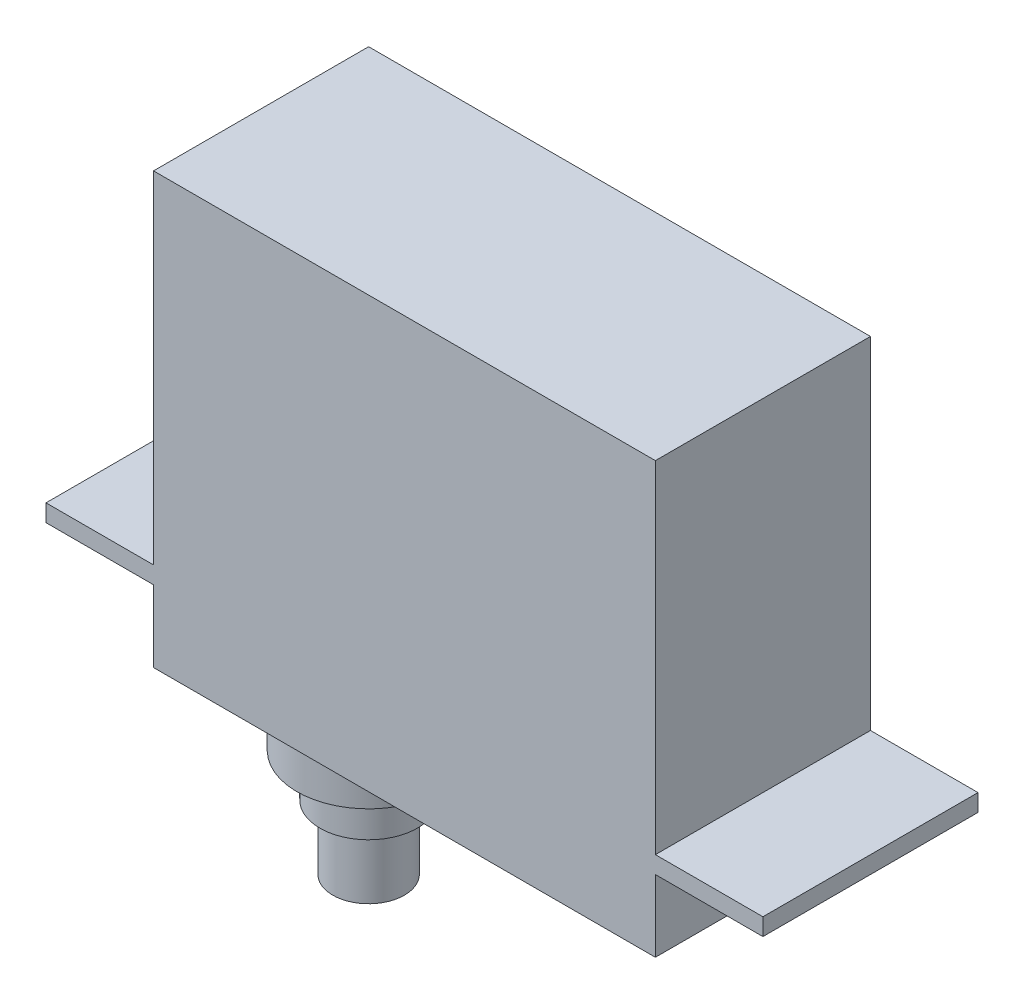
ISO-10303-21;
HEADER;
FILE_DESCRIPTION(('STEP AP214'),'2;1');
FILE_NAME('part.step','',(''),(''),'','','');
FILE_SCHEMA(('AUTOMOTIVE_DESIGN { 1 0 10303 214 1 1 1 1 }'));
ENDSEC;
DATA;
#1=APPLICATION_CONTEXT('core data for automotive mechanical design processes');
#2=APPLICATION_PROTOCOL_DEFINITION('international standard','automotive_design',2000,#1);
#3=PRODUCT_CONTEXT('',#1,'mechanical');
#4=PRODUCT('Part','Part','',(#3));
#5=PRODUCT_RELATED_PRODUCT_CATEGORY('part','',(#4));
#6=PRODUCT_DEFINITION_FORMATION('','',#4);
#7=PRODUCT_DEFINITION_CONTEXT('part definition',#1,'design');
#8=PRODUCT_DEFINITION('design','',#6,#7);
#9=PRODUCT_DEFINITION_SHAPE('','',#8);
#10=(LENGTH_UNIT() NAMED_UNIT(*) SI_UNIT(.MILLI.,.METRE.));
#11=(NAMED_UNIT(*) PLANE_ANGLE_UNIT() SI_UNIT($,.RADIAN.));
#12=(NAMED_UNIT(*) SI_UNIT($,.STERADIAN.) SOLID_ANGLE_UNIT());
#13=UNCERTAINTY_MEASURE_WITH_UNIT(LENGTH_MEASURE(1.E-05),#10,'distance_accuracy_value','');
#14=(GEOMETRIC_REPRESENTATION_CONTEXT(3) GLOBAL_UNCERTAINTY_ASSIGNED_CONTEXT((#13)) GLOBAL_UNIT_ASSIGNED_CONTEXT((#10,
#11,#12)) REPRESENTATION_CONTEXT('',''));
#15=CARTESIAN_POINT('',(0.,0.,0.));
#16=DIRECTION('',(0.,0.,1.));
#17=DIRECTION('',(1.,0.,0.));
#18=AXIS2_PLACEMENT_3D('',#15,#16,#17);
#19=CARTESIAN_POINT('',(0.,-7.112,0.));
#20=DIRECTION('',(0.,-1.,0.));
#21=DIRECTION('',(1.,0.,0.));
#22=AXIS2_PLACEMENT_3D('',#19,#20,#21);
#23=PLANE('',#22);
#24=CARTESIAN_POINT('',(4.7625,-7.112,0.));
#25=DIRECTION('',(0.,-1.,0.));
#26=DIRECTION('',(1.,0.,0.));
#27=AXIS2_PLACEMENT_3D('',#24,#25,#26);
#28=CIRCLE('',#27,3.175);
#29=CARTESIAN_POINT('',(7.9375,-7.112,0.));
#30=VERTEX_POINT('',#29);
#31=EDGE_CURVE('E157',#30,#30,#28,.T.);
#32=ORIENTED_EDGE('',*,*,#31,.T.);
#33=EDGE_LOOP('',(#32));
#34=FACE_BOUND('',#33,.T.);
#35=CARTESIAN_POINT('',(4.7625,-7.112,0.));
#36=DIRECTION('',(0.,-1.,0.));
#37=DIRECTION('',(1.,0.,0.));
#38=AXIS2_PLACEMENT_3D('',#35,#36,#37);
#39=CIRCLE('',#38,2.159);
#40=CARTESIAN_POINT('',(2.6035,-7.112,0.));
#41=VERTEX_POINT('',#40);
#42=EDGE_CURVE('E452',#41,#41,#39,.T.);
#43=ORIENTED_EDGE('',*,*,#42,.F.);
#44=EDGE_LOOP('',(#43));
#45=FACE_BOUND('',#44,.T.);
#46=ADVANCED_FACE('F35',(#34,#45),#23,.T.);
#47=CARTESIAN_POINT('',(0.,-3.937,4.7625));
#48=DIRECTION('',(0.,-1.,0.));
#49=DIRECTION('',(1.,0.,0.));
#50=AXIS2_PLACEMENT_3D('',#47,#48,#49);
#51=PLANE('',#50);
#52=DIRECTION('',(-1.,0.,0.));
#53=VECTOR('',#52,1.);
#54=CARTESIAN_POINT('',(0.,-3.937,-4.7625));
#55=LINE('',#54,#53);
#56=CARTESIAN_POINT('',(22.225,-3.937,-4.7625));
#57=VERTEX_POINT('',#56);
#58=CARTESIAN_POINT('',(0.,-3.937,-4.7625));
#59=VERTEX_POINT('',#58);
#60=EDGE_CURVE('E166',#57,#59,#55,.T.);
#61=ORIENTED_EDGE('',*,*,#60,.F.);
#62=DIRECTION('',(0.,0.,-1.));
#63=VECTOR('',#62,1.);
#64=CARTESIAN_POINT('',(22.225,-3.937,4.7625));
#65=LINE('',#64,#63);
#66=CARTESIAN_POINT('',(22.225,-3.937,4.7625));
#67=VERTEX_POINT('',#66);
#68=EDGE_CURVE('E197',#67,#57,#65,.T.);
#69=ORIENTED_EDGE('',*,*,#68,.F.);
#70=DIRECTION('',(-1.,0.,0.));
#71=VECTOR('',#70,1.);
#72=CARTESIAN_POINT('',(0.,-3.937,4.7625));
#73=LINE('',#72,#71);
#74=CARTESIAN_POINT('',(0.,-3.937,4.7625));
#75=VERTEX_POINT('',#74);
#76=EDGE_CURVE('E227',#67,#75,#73,.T.);
#77=ORIENTED_EDGE('',*,*,#76,.T.);
#78=DIRECTION('',(0.,0.,-1.));
#79=VECTOR('',#78,1.);
#80=CARTESIAN_POINT('',(0.,-3.937,4.7625));
#81=LINE('',#80,#79);
#82=EDGE_CURVE('E199',#75,#59,#81,.T.);
#83=ORIENTED_EDGE('',*,*,#82,.T.);
#84=EDGE_LOOP('',(#61,#69,#77,#83));
#85=FACE_BOUND('',#84,.T.);
#86=CARTESIAN_POINT('',(4.7625,-3.937,0.));
#87=DIRECTION('',(0.,-1.,0.));
#88=DIRECTION('',(1.,0.,0.));
#89=AXIS2_PLACEMENT_3D('',#86,#87,#88);
#90=CIRCLE('',#89,3.175);
#91=CARTESIAN_POINT('',(7.9375,-3.937,0.));
#92=VERTEX_POINT('',#91);
#93=EDGE_CURVE('E444',#92,#92,#90,.T.);
#94=ORIENTED_EDGE('',*,*,#93,.F.);
#95=EDGE_LOOP('',(#94));
#96=FACE_BOUND('',#95,.T.);
#97=ADVANCED_FACE('F256',(#85,#96),#51,.T.);
#98=CARTESIAN_POINT('',(0.,0.,4.7625));
#99=DIRECTION('',(0.,1.,0.));
#100=DIRECTION('',(0.,0.,1.));
#101=AXIS2_PLACEMENT_3D('',#98,#99,#100);
#102=PLANE('',#101);
#103=DIRECTION('',(1.,0.,0.));
#104=VECTOR('',#103,1.);
#105=CARTESIAN_POINT('',(0.,0.,-4.7625));
#106=LINE('',#105,#104);
#107=CARTESIAN_POINT('',(-4.7625,0.,-4.7625));
#108=VERTEX_POINT('',#107);
#109=CARTESIAN_POINT('',(0.,0.,-4.7625));
#110=VERTEX_POINT('',#109);
#111=EDGE_CURVE('E154',#108,#110,#106,.T.);
#112=ORIENTED_EDGE('',*,*,#111,.F.);
#113=DIRECTION('',(0.,0.,-1.));
#114=VECTOR('',#113,1.);
#115=CARTESIAN_POINT('',(-4.7625,0.,4.7625));
#116=LINE('',#115,#114);
#117=CARTESIAN_POINT('',(-4.7625,0.,4.7625));
#118=VERTEX_POINT('',#117);
#119=EDGE_CURVE('E11',#118,#108,#116,.T.);
#120=ORIENTED_EDGE('',*,*,#119,.F.);
#121=DIRECTION('',(1.,0.,0.));
#122=VECTOR('',#121,1.);
#123=CARTESIAN_POINT('',(0.,0.,4.7625));
#124=LINE('',#123,#122);
#125=CARTESIAN_POINT('',(0.,0.,4.7625));
#126=VERTEX_POINT('',#125);
#127=EDGE_CURVE('E187',#118,#126,#124,.T.);
#128=ORIENTED_EDGE('',*,*,#127,.T.);
#129=DIRECTION('',(0.,0.,-1.));
#130=VECTOR('',#129,1.);
#131=CARTESIAN_POINT('',(0.,0.,4.7625));
#132=LINE('',#131,#130);
#133=EDGE_CURVE('E53',#126,#110,#132,.T.);
#134=ORIENTED_EDGE('',*,*,#133,.T.);
#135=EDGE_LOOP('',(#112,#120,#128,#134));
#136=FACE_BOUND('',#135,.T.);
#137=ADVANCED_FACE('F37',(#136),#102,.T.);
#138=CARTESIAN_POINT('',(-4.7625,0.,4.7625));
#139=DIRECTION('',(-1.,0.,0.));
#140=DIRECTION('',(0.,0.,1.));
#141=AXIS2_PLACEMENT_3D('',#138,#139,#140);
#142=PLANE('',#141);
#143=DIRECTION('',(0.,1.,0.));
#144=VECTOR('',#143,1.);
#145=CARTESIAN_POINT('',(-4.7625,0.,-4.7625));
#146=LINE('',#145,#144);
#147=CARTESIAN_POINT('',(-4.7625,-0.762000000000001,-4.7625));
#148=VERTEX_POINT('',#147);
#149=EDGE_CURVE('E156',#148,#108,#146,.T.);
#150=ORIENTED_EDGE('',*,*,#149,.F.);
#151=DIRECTION('',(0.,0.,-1.));
#152=VECTOR('',#151,1.);
#153=CARTESIAN_POINT('',(-4.7625,-0.762000000000001,4.7625));
#154=LINE('',#153,#152);
#155=CARTESIAN_POINT('',(-4.7625,-0.762000000000001,4.7625));
#156=VERTEX_POINT('',#155);
#157=EDGE_CURVE('E45',#156,#148,#154,.T.);
#158=ORIENTED_EDGE('',*,*,#157,.F.);
#159=DIRECTION('',(0.,1.,0.));
#160=VECTOR('',#159,1.);
#161=CARTESIAN_POINT('',(-4.7625,0.,4.7625));
#162=LINE('',#161,#160);
#163=EDGE_CURVE('E225',#156,#118,#162,.T.);
#164=ORIENTED_EDGE('',*,*,#163,.T.);
#165=ORIENTED_EDGE('',*,*,#119,.T.);
#166=EDGE_LOOP('',(#150,#158,#164,#165));
#167=FACE_BOUND('',#166,.T.);
#168=ADVANCED_FACE('F213',(#167),#142,.T.);
#169=CARTESIAN_POINT('',(0.,-0.762,4.7625));
#170=DIRECTION('',(0.,-1.,0.));
#171=DIRECTION('',(1.,0.,0.));
#172=AXIS2_PLACEMENT_3D('',#169,#170,#171);
#173=PLANE('',#172);
#174=DIRECTION('',(-1.,0.,0.));
#175=VECTOR('',#174,1.);
#176=CARTESIAN_POINT('',(0.,-0.762,-4.7625));
#177=LINE('',#176,#175);
#178=CARTESIAN_POINT('',(0.,-0.762,-4.7625));
#179=VERTEX_POINT('',#178);
#180=EDGE_CURVE('E160',#179,#148,#177,.T.);
#181=ORIENTED_EDGE('',*,*,#180,.F.);
#182=DIRECTION('',(0.,0.,-1.));
#183=VECTOR('',#182,1.);
#184=CARTESIAN_POINT('',(0.,-0.762,4.7625));
#185=LINE('',#184,#183);
#186=CARTESIAN_POINT('',(0.,-0.762,4.7625));
#187=VERTEX_POINT('',#186);
#188=EDGE_CURVE('E201',#187,#179,#185,.T.);
#189=ORIENTED_EDGE('',*,*,#188,.F.);
#190=DIRECTION('',(-1.,0.,0.));
#191=VECTOR('',#190,1.);
#192=CARTESIAN_POINT('',(0.,-0.762,4.7625));
#193=LINE('',#192,#191);
#194=EDGE_CURVE('E209',#187,#156,#193,.T.);
#195=ORIENTED_EDGE('',*,*,#194,.T.);
#196=ORIENTED_EDGE('',*,*,#157,.T.);
#197=EDGE_LOOP('',(#181,#189,#195,#196));
#198=FACE_BOUND('',#197,.T.);
#199=ADVANCED_FACE('F207',(#198),#173,.T.);
#200=CARTESIAN_POINT('',(0.,0.,4.7625));
#201=DIRECTION('',(-1.,0.,0.));
#202=DIRECTION('',(0.,0.,1.));
#203=AXIS2_PLACEMENT_3D('',#200,#201,#202);
#204=PLANE('',#203);
#205=DIRECTION('',(0.,1.,0.));
#206=VECTOR('',#205,1.);
#207=CARTESIAN_POINT('',(0.,0.,-4.7625));
#208=LINE('',#207,#206);
#209=EDGE_CURVE('E163',#59,#179,#208,.T.);
#210=ORIENTED_EDGE('',*,*,#209,.F.);
#211=ORIENTED_EDGE('',*,*,#82,.F.);
#212=DIRECTION('',(0.,1.,0.));
#213=VECTOR('',#212,1.);
#214=CARTESIAN_POINT('',(0.,0.,4.7625));
#215=LINE('',#214,#213);
#216=EDGE_CURVE('E222',#75,#187,#215,.T.);
#217=ORIENTED_EDGE('',*,*,#216,.T.);
#218=ORIENTED_EDGE('',*,*,#188,.T.);
#219=EDGE_LOOP('',(#210,#211,#217,#218));
#220=FACE_BOUND('',#219,.T.);
#221=ADVANCED_FACE('F219',(#220),#204,.T.);
#222=CARTESIAN_POINT('',(22.225,0.,4.7625));
#223=DIRECTION('',(1.,0.,0.));
#224=DIRECTION('',(0.,0.,-1.));
#225=AXIS2_PLACEMENT_3D('',#222,#223,#224);
#226=PLANE('',#225);
#227=DIRECTION('',(0.,-1.,0.));
#228=VECTOR('',#227,1.);
#229=CARTESIAN_POINT('',(22.225,0.,-4.7625));
#230=LINE('',#229,#228);
#231=CARTESIAN_POINT('',(22.225,-0.761999999999997,-4.7625));
#232=VERTEX_POINT('',#231);
#233=EDGE_CURVE('E169',#232,#57,#230,.T.);
#234=ORIENTED_EDGE('',*,*,#233,.F.);
#235=DIRECTION('',(0.,0.,-1.));
#236=VECTOR('',#235,1.);
#237=CARTESIAN_POINT('',(22.225,-0.761999999999997,4.7625));
#238=LINE('',#237,#236);
#239=CARTESIAN_POINT('',(22.225,-0.761999999999997,4.7625));
#240=VERTEX_POINT('',#239);
#241=EDGE_CURVE('E195',#240,#232,#238,.T.);
#242=ORIENTED_EDGE('',*,*,#241,.F.);
#243=DIRECTION('',(0.,-1.,0.));
#244=VECTOR('',#243,1.);
#245=CARTESIAN_POINT('',(22.225,0.,4.7625));
#246=LINE('',#245,#244);
#247=EDGE_CURVE('E233',#240,#67,#246,.T.);
#248=ORIENTED_EDGE('',*,*,#247,.T.);
#249=ORIENTED_EDGE('',*,*,#68,.T.);
#250=EDGE_LOOP('',(#234,#242,#248,#249));
#251=FACE_BOUND('',#250,.T.);
#252=ADVANCED_FACE('F363',(#251),#226,.T.);
#253=CARTESIAN_POINT('',(0.,-0.762,4.7625));
#254=DIRECTION('',(0.,-1.,0.));
#255=DIRECTION('',(1.,0.,0.));
#256=AXIS2_PLACEMENT_3D('',#253,#254,#255);
#257=PLANE('',#256);
#258=DIRECTION('',(-1.,0.,0.));
#259=VECTOR('',#258,1.);
#260=CARTESIAN_POINT('',(0.,-0.762,-4.7625));
#261=LINE('',#260,#259);
#262=CARTESIAN_POINT('',(26.9875,-0.761999999999997,-4.7625));
#263=VERTEX_POINT('',#262);
#264=EDGE_CURVE('E172',#263,#232,#261,.T.);
#265=ORIENTED_EDGE('',*,*,#264,.F.);
#266=DIRECTION('',(0.,0.,-1.));
#267=VECTOR('',#266,1.);
#268=CARTESIAN_POINT('',(26.9875,-0.761999999999997,4.7625));
#269=LINE('',#268,#267);
#270=CARTESIAN_POINT('',(26.9875,-0.761999999999997,4.7625));
#271=VERTEX_POINT('',#270);
#272=EDGE_CURVE('E193',#271,#263,#269,.T.);
#273=ORIENTED_EDGE('',*,*,#272,.F.);
#274=DIRECTION('',(-1.,0.,0.));
#275=VECTOR('',#274,1.);
#276=CARTESIAN_POINT('',(0.,-0.762,4.7625));
#277=LINE('',#276,#275);
#278=EDGE_CURVE('E236',#271,#240,#277,.T.);
#279=ORIENTED_EDGE('',*,*,#278,.T.);
#280=ORIENTED_EDGE('',*,*,#241,.T.);
#281=EDGE_LOOP('',(#265,#273,#279,#280));
#282=FACE_BOUND('',#281,.T.);
#283=ADVANCED_FACE('F370',(#282),#257,.T.);
#284=CARTESIAN_POINT('',(26.9875,0.,4.7625));
#285=DIRECTION('',(1.,0.,0.));
#286=DIRECTION('',(0.,0.,-1.));
#287=AXIS2_PLACEMENT_3D('',#284,#285,#286);
#288=PLANE('',#287);
#289=DIRECTION('',(0.,-1.,0.));
#290=VECTOR('',#289,1.);
#291=CARTESIAN_POINT('',(26.9875,0.,-4.7625));
#292=LINE('',#291,#290);
#293=CARTESIAN_POINT('',(26.9875,0.,-4.7625));
#294=VERTEX_POINT('',#293);
#295=EDGE_CURVE('E175',#294,#263,#292,.T.);
#296=ORIENTED_EDGE('',*,*,#295,.F.);
#297=DIRECTION('',(0.,0.,-1.));
#298=VECTOR('',#297,1.);
#299=CARTESIAN_POINT('',(26.9875,0.,4.7625));
#300=LINE('',#299,#298);
#301=CARTESIAN_POINT('',(26.9875,0.,4.7625));
#302=VERTEX_POINT('',#301);
#303=EDGE_CURVE('E191',#302,#294,#300,.T.);
#304=ORIENTED_EDGE('',*,*,#303,.F.);
#305=DIRECTION('',(0.,-1.,0.));
#306=VECTOR('',#305,1.);
#307=CARTESIAN_POINT('',(26.9875,0.,4.7625));
#308=LINE('',#307,#306);
#309=EDGE_CURVE('E239',#302,#271,#308,.T.);
#310=ORIENTED_EDGE('',*,*,#309,.T.);
#311=ORIENTED_EDGE('',*,*,#272,.T.);
#312=EDGE_LOOP('',(#296,#304,#310,#311));
#313=FACE_BOUND('',#312,.T.);
#314=ADVANCED_FACE('F378',(#313),#288,.T.);
#315=CARTESIAN_POINT('',(0.,0.,4.7625));
#316=DIRECTION('',(0.,1.,0.));
#317=DIRECTION('',(-1.,0.,0.));
#318=AXIS2_PLACEMENT_3D('',#315,#316,#317);
#319=PLANE('',#318);
#320=DIRECTION('',(1.,0.,0.));
#321=VECTOR('',#320,1.);
#322=CARTESIAN_POINT('',(0.,0.,-4.7625));
#323=LINE('',#322,#321);
#324=CARTESIAN_POINT('',(22.225,0.,-4.7625));
#325=VERTEX_POINT('',#324);
#326=EDGE_CURVE('E178',#325,#294,#323,.T.);
#327=ORIENTED_EDGE('',*,*,#326,.F.);
#328=DIRECTION('',(0.,0.,-1.));
#329=VECTOR('',#328,1.);
#330=CARTESIAN_POINT('',(22.225,0.,4.7625));
#331=LINE('',#330,#329);
#332=CARTESIAN_POINT('',(22.225,0.,4.7625));
#333=VERTEX_POINT('',#332);
#334=EDGE_CURVE('E136',#333,#325,#331,.T.);
#335=ORIENTED_EDGE('',*,*,#334,.F.);
#336=DIRECTION('',(1.,0.,0.));
#337=VECTOR('',#336,1.);
#338=CARTESIAN_POINT('',(0.,0.,4.7625));
#339=LINE('',#338,#337);
#340=EDGE_CURVE('E146',#333,#302,#339,.T.);
#341=ORIENTED_EDGE('',*,*,#340,.T.);
#342=ORIENTED_EDGE('',*,*,#303,.T.);
#343=EDGE_LOOP('',(#327,#335,#341,#342));
#344=FACE_BOUND('',#343,.T.);
#345=ADVANCED_FACE('F243',(#344),#319,.T.);
#346=CARTESIAN_POINT('',(22.225,0.,4.7625));
#347=DIRECTION('',(1.,0.,0.));
#348=DIRECTION('',(0.,1.,0.));
#349=AXIS2_PLACEMENT_3D('',#346,#347,#348);
#350=PLANE('',#349);
#351=DIRECTION('',(0.,-1.,0.));
#352=VECTOR('',#351,1.);
#353=CARTESIAN_POINT('',(22.225,0.,-4.7625));
#354=LINE('',#353,#352);
#355=CARTESIAN_POINT('',(22.225,15.113,-4.7625));
#356=VERTEX_POINT('',#355);
#357=EDGE_CURVE('E132',#356,#325,#354,.T.);
#358=ORIENTED_EDGE('',*,*,#357,.F.);
#359=DIRECTION('',(0.,0.,-1.));
#360=VECTOR('',#359,1.);
#361=CARTESIAN_POINT('',(22.225,15.113,4.7625));
#362=LINE('',#361,#360);
#363=CARTESIAN_POINT('',(22.225,15.113,4.7625));
#364=VERTEX_POINT('',#363);
#365=EDGE_CURVE('E127',#364,#356,#362,.T.);
#366=ORIENTED_EDGE('',*,*,#365,.F.);
#367=DIRECTION('',(0.,-1.,0.));
#368=VECTOR('',#367,1.);
#369=CARTESIAN_POINT('',(22.225,0.,4.7625));
#370=LINE('',#369,#368);
#371=EDGE_CURVE('E130',#364,#333,#370,.T.);
#372=ORIENTED_EDGE('',*,*,#371,.T.);
#373=ORIENTED_EDGE('',*,*,#334,.T.);
#374=EDGE_LOOP('',(#358,#366,#372,#373));
#375=FACE_BOUND('',#374,.T.);
#376=ADVANCED_FACE('F129',(#375),#350,.T.);
#377=CARTESIAN_POINT('',(0.,15.113,4.7625));
#378=DIRECTION('',(0.,1.,0.));
#379=DIRECTION('',(0.,0.,1.));
#380=AXIS2_PLACEMENT_3D('',#377,#378,#379);
#381=PLANE('',#380);
#382=DIRECTION('',(1.,0.,0.));
#383=VECTOR('',#382,1.);
#384=CARTESIAN_POINT('',(0.,15.113,-4.7625));
#385=LINE('',#384,#383);
#386=CARTESIAN_POINT('',(0.,15.113,-4.7625));
#387=VERTEX_POINT('',#386);
#388=EDGE_CURVE('E182',#387,#356,#385,.T.);
#389=ORIENTED_EDGE('',*,*,#388,.F.);
#390=DIRECTION('',(0.,0.,-1.));
#391=VECTOR('',#390,1.);
#392=CARTESIAN_POINT('',(0.,15.113,4.7625));
#393=LINE('',#392,#391);
#394=CARTESIAN_POINT('',(0.,15.113,4.7625));
#395=VERTEX_POINT('',#394);
#396=EDGE_CURVE('E90',#395,#387,#393,.T.);
#397=ORIENTED_EDGE('',*,*,#396,.F.);
#398=DIRECTION('',(1.,0.,0.));
#399=VECTOR('',#398,1.);
#400=CARTESIAN_POINT('',(0.,15.113,4.7625));
#401=LINE('',#400,#399);
#402=EDGE_CURVE('E143',#395,#364,#401,.T.);
#403=ORIENTED_EDGE('',*,*,#402,.T.);
#404=ORIENTED_EDGE('',*,*,#365,.T.);
#405=EDGE_LOOP('',(#389,#397,#403,#404));
#406=FACE_BOUND('',#405,.T.);
#407=ADVANCED_FACE('F148',(#406),#381,.T.);
#408=CARTESIAN_POINT('',(0.,0.,4.7625));
#409=DIRECTION('',(-1.,0.,0.));
#410=DIRECTION('',(0.,0.,1.));
#411=AXIS2_PLACEMENT_3D('',#408,#409,#410);
#412=PLANE('',#411);
#413=DIRECTION('',(0.,1.,0.));
#414=VECTOR('',#413,1.);
#415=CARTESIAN_POINT('',(0.,0.,-4.7625));
#416=LINE('',#415,#414);
#417=EDGE_CURVE('E184',#110,#387,#416,.T.);
#418=ORIENTED_EDGE('',*,*,#417,.F.);
#419=ORIENTED_EDGE('',*,*,#133,.F.);
#420=DIRECTION('',(0.,1.,0.));
#421=VECTOR('',#420,1.);
#422=CARTESIAN_POINT('',(0.,0.,4.7625));
#423=LINE('',#422,#421);
#424=EDGE_CURVE('E149',#126,#395,#423,.T.);
#425=ORIENTED_EDGE('',*,*,#424,.T.);
#426=ORIENTED_EDGE('',*,*,#396,.T.);
#427=EDGE_LOOP('',(#418,#419,#425,#426));
#428=FACE_BOUND('',#427,.T.);
#429=ADVANCED_FACE('F245',(#428),#412,.T.);
#430=CARTESIAN_POINT('',(0.,0.,4.7625));
#431=DIRECTION('',(0.,0.,1.));
#432=DIRECTION('',(1.,0.,0.));
#433=AXIS2_PLACEMENT_3D('',#430,#431,#432);
#434=PLANE('',#433);
#435=ORIENTED_EDGE('',*,*,#127,.F.);
#436=ORIENTED_EDGE('',*,*,#163,.F.);
#437=ORIENTED_EDGE('',*,*,#194,.F.);
#438=ORIENTED_EDGE('',*,*,#216,.F.);
#439=ORIENTED_EDGE('',*,*,#76,.F.);
#440=ORIENTED_EDGE('',*,*,#247,.F.);
#441=ORIENTED_EDGE('',*,*,#278,.F.);
#442=ORIENTED_EDGE('',*,*,#309,.F.);
#443=ORIENTED_EDGE('',*,*,#340,.F.);
#444=ORIENTED_EDGE('',*,*,#371,.F.);
#445=ORIENTED_EDGE('',*,*,#402,.F.);
#446=ORIENTED_EDGE('',*,*,#424,.F.);
#447=EDGE_LOOP('',(#435,#436,#437,#438,#439,#440,#441,#442,#443,#444,#445,#446));
#448=FACE_BOUND('',#447,.T.);
#449=ADVANCED_FACE('F141',(#448),#434,.T.);
#450=CARTESIAN_POINT('',(0.,0.,-4.7625));
#451=DIRECTION('',(0.,0.,1.));
#452=DIRECTION('',(1.,0.,0.));
#453=AXIS2_PLACEMENT_3D('',#450,#451,#452);
#454=PLANE('',#453);
#455=ORIENTED_EDGE('',*,*,#111,.T.);
#456=ORIENTED_EDGE('',*,*,#417,.T.);
#457=ORIENTED_EDGE('',*,*,#388,.T.);
#458=ORIENTED_EDGE('',*,*,#357,.T.);
#459=ORIENTED_EDGE('',*,*,#326,.T.);
#460=ORIENTED_EDGE('',*,*,#295,.T.);
#461=ORIENTED_EDGE('',*,*,#264,.T.);
#462=ORIENTED_EDGE('',*,*,#233,.T.);
#463=ORIENTED_EDGE('',*,*,#60,.T.);
#464=ORIENTED_EDGE('',*,*,#209,.T.);
#465=ORIENTED_EDGE('',*,*,#180,.T.);
#466=ORIENTED_EDGE('',*,*,#149,.T.);
#467=EDGE_LOOP('',(#455,#456,#457,#458,#459,#460,#461,#462,#463,#464,#465,#466));
#468=FACE_BOUND('',#467,.T.);
#469=ADVANCED_FACE('F215',(#468),#454,.F.);
#470=CARTESIAN_POINT('',(4.7625,-7.112,0.));
#471=DIRECTION('',(0.,1.,0.));
#472=DIRECTION('',(-1.,0.,0.));
#473=AXIS2_PLACEMENT_3D('',#470,#471,#472);
#474=CYLINDRICAL_SURFACE('',#473,3.175);
#475=ORIENTED_EDGE('',*,*,#31,.F.);
#476=EDGE_LOOP('',(#475));
#477=FACE_BOUND('',#476,.T.);
#478=ORIENTED_EDGE('',*,*,#93,.T.);
#479=EDGE_LOOP('',(#478));
#480=FACE_BOUND('',#479,.T.);
#481=ADVANCED_FACE('F270',(#477,#480),#474,.T.);
#482=CARTESIAN_POINT('',(4.7625,-9.017,0.));
#483=DIRECTION('',(0.,-1.,0.));
#484=DIRECTION('',(1.,0.,0.));
#485=AXIS2_PLACEMENT_3D('',#482,#483,#484);
#486=PLANE('',#485);
#487=CARTESIAN_POINT('',(4.7625,-9.017,0.));
#488=DIRECTION('',(0.,-1.,0.));
#489=DIRECTION('',(1.,0.,0.));
#490=AXIS2_PLACEMENT_3D('',#487,#488,#489);
#491=CIRCLE('',#490,2.159);
#492=CARTESIAN_POINT('',(2.6035,-9.017,0.));
#493=VERTEX_POINT('',#492);
#494=EDGE_CURVE('E455',#493,#493,#491,.T.);
#495=ORIENTED_EDGE('',*,*,#494,.T.);
#496=EDGE_LOOP('',(#495));
#497=FACE_BOUND('',#496,.T.);
#498=CARTESIAN_POINT('',(4.7625,-9.017,0.));
#499=DIRECTION('',(0.,-1.,0.));
#500=DIRECTION('',(1.,0.,0.));
#501=AXIS2_PLACEMENT_3D('',#498,#499,#500);
#502=CIRCLE('',#501,1.5875);
#503=CARTESIAN_POINT('',(6.35,-9.017,0.));
#504=VERTEX_POINT('',#503);
#505=EDGE_CURVE('E39',#504,#504,#502,.T.);
#506=ORIENTED_EDGE('',*,*,#505,.F.);
#507=EDGE_LOOP('',(#506));
#508=FACE_BOUND('',#507,.T.);
#509=ADVANCED_FACE('F272',(#497,#508),#486,.T.);
#510=CARTESIAN_POINT('',(4.7625,-9.017,0.));
#511=DIRECTION('',(0.,1.,0.));
#512=DIRECTION('',(-1.,0.,0.));
#513=AXIS2_PLACEMENT_3D('',#510,#511,#512);
#514=CYLINDRICAL_SURFACE('',#513,2.159);
#515=CARTESIAN_POINT('',(2.6035,-9.017,0.));
#516=CARTESIAN_POINT('',(2.6035,-8.99715625,0.));
#517=CARTESIAN_POINT('',(2.6035,-8.9773125,0.));
#518=CARTESIAN_POINT('',(2.6035,-8.937625,0.));
#519=CARTESIAN_POINT('',(2.6035,-8.91778125,0.));
#520=CARTESIAN_POINT('',(2.6035,-8.87809375,0.));
#521=CARTESIAN_POINT('',(2.6035,-8.85825,0.));
#522=CARTESIAN_POINT('',(2.6035,-8.8185625,0.));
#523=CARTESIAN_POINT('',(2.6035,-8.79871875,0.));
#524=CARTESIAN_POINT('',(2.6035,-8.75903125,0.));
#525=CARTESIAN_POINT('',(2.6035,-8.7391875,0.));
#526=CARTESIAN_POINT('',(2.6035,-8.6995,0.));
#527=CARTESIAN_POINT('',(2.6035,-8.67965625,0.));
#528=CARTESIAN_POINT('',(2.6035,-8.63996875,0.));
#529=CARTESIAN_POINT('',(2.6035,-8.620125,0.));
#530=CARTESIAN_POINT('',(2.6035,-8.5804375,0.));
#531=CARTESIAN_POINT('',(2.6035,-8.56059375,0.));
#532=CARTESIAN_POINT('',(2.6035,-8.52090625,0.));
#533=CARTESIAN_POINT('',(2.6035,-8.5010625,0.));
#534=CARTESIAN_POINT('',(2.6035,-8.461375,0.));
#535=CARTESIAN_POINT('',(2.6035,-8.44153125,0.));
#536=CARTESIAN_POINT('',(2.6035,-8.40184375,0.));
#537=CARTESIAN_POINT('',(2.6035,-8.382,0.));
#538=CARTESIAN_POINT('',(2.6035,-8.3423125,0.));
#539=CARTESIAN_POINT('',(2.6035,-8.32246875,0.));
#540=CARTESIAN_POINT('',(2.6035,-8.28278125,0.));
#541=CARTESIAN_POINT('',(2.6035,-8.2629375,0.));
#542=CARTESIAN_POINT('',(2.6035,-8.22325,0.));
#543=CARTESIAN_POINT('',(2.6035,-8.20340625,0.));
#544=CARTESIAN_POINT('',(2.6035,-8.16371875,0.));
#545=CARTESIAN_POINT('',(2.6035,-8.143875,0.));
#546=CARTESIAN_POINT('',(2.6035,-8.1041875,0.));
#547=CARTESIAN_POINT('',(2.6035,-8.08434375,0.));
#548=CARTESIAN_POINT('',(2.6035,-8.04465625,0.));
#549=CARTESIAN_POINT('',(2.6035,-8.0248125,0.));
#550=CARTESIAN_POINT('',(2.6035,-7.985125,0.));
#551=CARTESIAN_POINT('',(2.6035,-7.96528125,0.));
#552=CARTESIAN_POINT('',(2.6035,-7.92559375,0.));
#553=CARTESIAN_POINT('',(2.6035,-7.90575,0.));
#554=CARTESIAN_POINT('',(2.6035,-7.8660625,0.));
#555=CARTESIAN_POINT('',(2.6035,-7.84621875,0.));
#556=CARTESIAN_POINT('',(2.6035,-7.80653125,0.));
#557=CARTESIAN_POINT('',(2.6035,-7.7866875,0.));
#558=CARTESIAN_POINT('',(2.6035,-7.747,0.));
#559=CARTESIAN_POINT('',(2.6035,-7.72715625,0.));
#560=CARTESIAN_POINT('',(2.6035,-7.68746875,0.));
#561=CARTESIAN_POINT('',(2.6035,-7.667625,0.));
#562=CARTESIAN_POINT('',(2.6035,-7.6279375,0.));
#563=CARTESIAN_POINT('',(2.6035,-7.60809375,0.));
#564=CARTESIAN_POINT('',(2.6035,-7.56840625,0.));
#565=CARTESIAN_POINT('',(2.6035,-7.5485625,0.));
#566=CARTESIAN_POINT('',(2.6035,-7.508875,0.));
#567=CARTESIAN_POINT('',(2.6035,-7.48903125,0.));
#568=CARTESIAN_POINT('',(2.6035,-7.44934375,0.));
#569=CARTESIAN_POINT('',(2.6035,-7.4295,0.));
#570=CARTESIAN_POINT('',(2.6035,-7.3898125,0.));
#571=CARTESIAN_POINT('',(2.6035,-7.36996875,0.));
#572=CARTESIAN_POINT('',(2.6035,-7.33028125,0.));
#573=CARTESIAN_POINT('',(2.6035,-7.3104375,0.));
#574=CARTESIAN_POINT('',(2.6035,-7.27075,0.));
#575=CARTESIAN_POINT('',(2.6035,-7.25090625,0.));
#576=CARTESIAN_POINT('',(2.6035,-7.21121875,0.));
#577=CARTESIAN_POINT('',(2.6035,-7.191375,0.));
#578=CARTESIAN_POINT('',(2.6035,-7.1516875,0.));
#579=CARTESIAN_POINT('',(2.6035,-7.13184375,0.));
#580=CARTESIAN_POINT('',(2.6035,-7.112,0.));
#581=B_SPLINE_CURVE_WITH_KNOTS('',3,(#515,#516,#517,#518,#519,#520,#521,#522,#523,#524,#525,
#526,#527,#528,#529,#530,#531,#532,#533,#534,#535,#536,#537,#538,#539,#540,#541,#542,#543,#544,
#545,#546,#547,#548,#549,#550,#551,#552,#553,#554,#555,#556,#557,#558,#559,#560,#561,#562,#563,
#564,#565,#566,#567,#568,#569,#570,#571,#572,#573,#574,#575,#576,#577,#578,#579,#580),
.UNSPECIFIED.,.F.,.F.,(4,2,2,2,2,2,2,2,2,2,2,2,2,2,2,2,2,2,2,2,2,2,2,2,2,2,2,2,2,2,2,2,4),(0.,
0.0595312499999997,0.119062499999999,0.178593749999999,0.238124999999999,0.297656249999998,
0.357187499999998,0.41671875,0.476249999999999,0.535781249999999,0.595312499999999,
0.654843749999998,0.714374999999998,0.773906249999999,0.833437499999999,0.892968749999999,
0.952499999999998,1.01203125,1.0715625,1.13109375,1.190625,1.25015625,1.3096875,1.36921875,
1.42875,1.48828125,1.5478125,1.60734375,1.666875,1.72640625,1.7859375,1.84546875,1.905),.UNSPECIFIED.);
#582=EDGE_CURVE('BSEAM291',#493,#41,#581,.T.);
#583=ORIENTED_EDGE('',*,*,#494,.F.);
#584=ORIENTED_EDGE('',*,*,#42,.T.);
#585=ORIENTED_EDGE('',*,*,#582,.T.);
#586=ORIENTED_EDGE('',*,*,#582,.F.);
#587=EDGE_LOOP('',(#583,#585,#584,#586));
#588=FACE_BOUND('',#587,.T.);
#589=ADVANCED_FACE('F291',(#588),#514,.T.);
#590=CARTESIAN_POINT('',(0.,-11.8745,0.));
#591=DIRECTION('',(0.,-1.,0.));
#592=DIRECTION('',(1.,0.,0.));
#593=AXIS2_PLACEMENT_3D('',#590,#591,#592);
#594=PLANE('',#593);
#595=CARTESIAN_POINT('',(4.7625,-11.8745,0.));
#596=DIRECTION('',(0.,-1.,0.));
#597=DIRECTION('',(1.,0.,0.));
#598=AXIS2_PLACEMENT_3D('',#595,#596,#597);
#599=CIRCLE('',#598,1.5875);
#600=CARTESIAN_POINT('',(6.35,-11.8745,0.));
#601=VERTEX_POINT('',#600);
#602=EDGE_CURVE('E446',#601,#601,#599,.T.);
#603=ORIENTED_EDGE('',*,*,#602,.T.);
#604=EDGE_LOOP('',(#603));
#605=FACE_BOUND('',#604,.T.);
#606=ADVANCED_FACE('F299',(#605),#594,.T.);
#607=CARTESIAN_POINT('',(4.7625,-11.8745,0.));
#608=DIRECTION('',(0.,1.,0.));
#609=DIRECTION('',(-1.,0.,0.));
#610=AXIS2_PLACEMENT_3D('',#607,#608,#609);
#611=CYLINDRICAL_SURFACE('',#610,1.5875);
#612=ORIENTED_EDGE('',*,*,#505,.T.);
#613=EDGE_LOOP('',(#612));
#614=FACE_BOUND('',#613,.T.);
#615=ORIENTED_EDGE('',*,*,#602,.F.);
#616=EDGE_LOOP('',(#615));
#617=FACE_BOUND('',#616,.T.);
#618=ADVANCED_FACE('F268',(#614,#617),#611,.T.);
#619=CLOSED_SHELL('',(#46,#97,#137,#168,#199,#221,#252,#283,#314,#345,#376,#407,#429,#449,#469,
#481,#509,#589,#606,#618));
#620=MANIFOLD_SOLID_BREP('B2',#619);
#621=ADVANCED_BREP_SHAPE_REPRESENTATION('',(#18,#620),#14);
#622=SHAPE_DEFINITION_REPRESENTATION(#9,#621);
ENDSEC;
END-ISO-10303-21;
